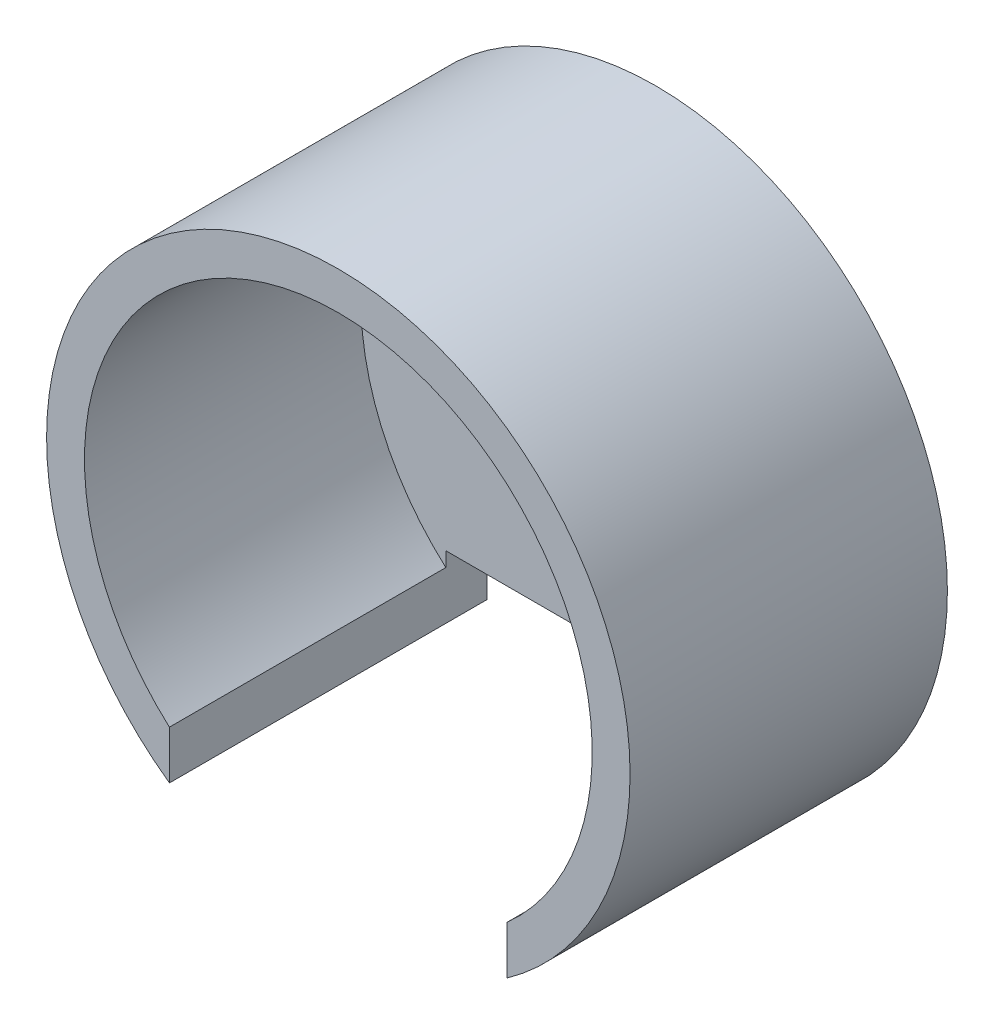
ISO-10303-21;
HEADER;
FILE_DESCRIPTION(('STEP AP214'),'2;1');
FILE_NAME('part.step','',(''),(''),'','','');
FILE_SCHEMA(('AUTOMOTIVE_DESIGN { 1 0 10303 214 1 1 1 1 }'));
ENDSEC;
DATA;
#1=APPLICATION_CONTEXT('core data for automotive mechanical design processes');
#2=APPLICATION_PROTOCOL_DEFINITION('international standard','automotive_design',2000,#1);
#3=PRODUCT_CONTEXT('',#1,'mechanical');
#4=PRODUCT('Part','Part','',(#3));
#5=PRODUCT_RELATED_PRODUCT_CATEGORY('part','',(#4));
#6=PRODUCT_DEFINITION_FORMATION('','',#4);
#7=PRODUCT_DEFINITION_CONTEXT('part definition',#1,'design');
#8=PRODUCT_DEFINITION('design','',#6,#7);
#9=PRODUCT_DEFINITION_SHAPE('','',#8);
#10=(LENGTH_UNIT() NAMED_UNIT(*) SI_UNIT(.MILLI.,.METRE.));
#11=(NAMED_UNIT(*) PLANE_ANGLE_UNIT() SI_UNIT($,.RADIAN.));
#12=(NAMED_UNIT(*) SI_UNIT($,.STERADIAN.) SOLID_ANGLE_UNIT());
#13=UNCERTAINTY_MEASURE_WITH_UNIT(LENGTH_MEASURE(1.E-05),#10,'distance_accuracy_value','');
#14=(GEOMETRIC_REPRESENTATION_CONTEXT(3) GLOBAL_UNCERTAINTY_ASSIGNED_CONTEXT((#13)) GLOBAL_UNIT_ASSIGNED_CONTEXT((#10,
#11,#12)) REPRESENTATION_CONTEXT('',''));
#15=CARTESIAN_POINT('',(0.,0.,0.));
#16=DIRECTION('',(0.,0.,1.));
#17=DIRECTION('',(1.,0.,0.));
#18=AXIS2_PLACEMENT_3D('',#15,#16,#17);
#19=CARTESIAN_POINT('',(0.,0.,13.5));
#20=DIRECTION('',(0.,0.,1.));
#21=DIRECTION('',(1.,0.,0.));
#22=AXIS2_PLACEMENT_3D('',#19,#20,#21);
#23=PLANE('',#22);
#24=DIRECTION('',(0.,1.,0.));
#25=VECTOR('',#24,1.);
#26=CARTESIAN_POINT('',(8.25,-16.2559009205842,13.5));
#27=LINE('',#26,#25);
#28=CARTESIAN_POINT('',(8.25,-11.6189500386223,13.5));
#29=VERTEX_POINT('',#28);
#30=CARTESIAN_POINT('',(8.25,-9.25729442115784,13.5));
#31=VERTEX_POINT('',#30);
#32=EDGE_CURVE('E163',#29,#31,#27,.T.);
#33=ORIENTED_EDGE('',*,*,#32,.F.);
#34=CARTESIAN_POINT('',(0.,0.,13.5));
#35=DIRECTION('',(0.,0.,1.));
#36=DIRECTION('',(1.,0.,0.));
#37=AXIS2_PLACEMENT_3D('',#34,#35,#36);
#38=CIRCLE('',#37,14.25);
#39=CARTESIAN_POINT('',(-8.25,-11.6189500386223,13.5));
#40=VERTEX_POINT('',#39);
#41=EDGE_CURVE('E102',#29,#40,#38,.T.);
#42=ORIENTED_EDGE('',*,*,#41,.T.);
#43=DIRECTION('',(0.,-1.,0.));
#44=VECTOR('',#43,1.);
#45=CARTESIAN_POINT('',(-8.25,-16.2559009205842,13.5));
#46=LINE('',#45,#44);
#47=CARTESIAN_POINT('',(-8.25,-9.25729442115784,13.5));
#48=VERTEX_POINT('',#47);
#49=EDGE_CURVE('E107',#48,#40,#46,.T.);
#50=ORIENTED_EDGE('',*,*,#49,.F.);
#51=CARTESIAN_POINT('',(0.,0.,13.5));
#52=DIRECTION('',(0.,0.,1.));
#53=DIRECTION('',(1.,0.,0.));
#54=AXIS2_PLACEMENT_3D('',#51,#52,#53);
#55=CIRCLE('',#54,12.4);
#56=EDGE_CURVE('E133',#31,#48,#55,.T.);
#57=ORIENTED_EDGE('',*,*,#56,.F.);
#58=EDGE_LOOP('',(#33,#42,#50,#57));
#59=FACE_BOUND('',#58,.T.);
#60=ADVANCED_FACE('F43',(#59),#23,.T.);
#61=CARTESIAN_POINT('',(0.,0.,13.5));
#62=DIRECTION('',(0.,0.,-1.));
#63=DIRECTION('',(-1.,0.,0.));
#64=AXIS2_PLACEMENT_3D('',#61,#62,#63);
#65=CYLINDRICAL_SURFACE('',#64,14.25);
#66=ORIENTED_EDGE('',*,*,#41,.F.);
#67=DIRECTION('',(0.,0.,-1.));
#68=VECTOR('',#67,1.);
#69=CARTESIAN_POINT('',(8.25,-11.6189500386223,13.5));
#70=LINE('',#69,#68);
#71=CARTESIAN_POINT('',(8.25,-11.6189500386223,-2.));
#72=VERTEX_POINT('',#71);
#73=EDGE_CURVE('E153',#29,#72,#70,.T.);
#74=ORIENTED_EDGE('',*,*,#73,.T.);
#75=CARTESIAN_POINT('',(0.,0.,-2.));
#76=DIRECTION('',(0.,0.,-1.));
#77=DIRECTION('',(-1.,0.,0.));
#78=AXIS2_PLACEMENT_3D('',#75,#76,#77);
#79=CIRCLE('',#78,14.25);
#80=CARTESIAN_POINT('',(-8.25,-11.6189500386223,-2.));
#81=VERTEX_POINT('',#80);
#82=EDGE_CURVE('E113',#81,#72,#79,.T.);
#83=ORIENTED_EDGE('',*,*,#82,.F.);
#84=DIRECTION('',(0.,0.,-1.));
#85=VECTOR('',#84,1.);
#86=CARTESIAN_POINT('',(-8.25,-11.6189500386223,13.5));
#87=LINE('',#86,#85);
#88=EDGE_CURVE('E142',#81,#40,#87,.F.);
#89=ORIENTED_EDGE('',*,*,#88,.T.);
#90=EDGE_LOOP('',(#66,#74,#83,#89));
#91=FACE_BOUND('',#90,.T.);
#92=ADVANCED_FACE('F45',(#91),#65,.T.);
#93=CARTESIAN_POINT('',(0.,0.,13.5));
#94=DIRECTION('',(0.,0.,-1.));
#95=DIRECTION('',(-1.,0.,0.));
#96=AXIS2_PLACEMENT_3D('',#93,#94,#95);
#97=CYLINDRICAL_SURFACE('',#96,12.4);
#98=DIRECTION('',(0.,0.,-1.));
#99=VECTOR('',#98,1.);
#100=CARTESIAN_POINT('',(8.25,-9.25729442115784,13.5));
#101=LINE('',#100,#99);
#102=CARTESIAN_POINT('',(8.25,-9.25729442115784,0.));
#103=VERTEX_POINT('',#102);
#104=EDGE_CURVE('E66',#31,#103,#101,.T.);
#105=ORIENTED_EDGE('',*,*,#104,.F.);
#106=ORIENTED_EDGE('',*,*,#56,.T.);
#107=DIRECTION('',(0.,0.,-1.));
#108=VECTOR('',#107,1.);
#109=CARTESIAN_POINT('',(-8.25,-9.25729442115784,13.5));
#110=LINE('',#109,#108);
#111=CARTESIAN_POINT('',(-8.25,-9.25729442115784,0.));
#112=VERTEX_POINT('',#111);
#113=EDGE_CURVE('E148',#112,#48,#110,.F.);
#114=ORIENTED_EDGE('',*,*,#113,.F.);
#115=CARTESIAN_POINT('',(0.,0.,0.));
#116=DIRECTION('',(0.,0.,1.));
#117=DIRECTION('',(1.,0.,0.));
#118=AXIS2_PLACEMENT_3D('',#115,#116,#117);
#119=CIRCLE('',#118,12.4);
#120=EDGE_CURVE('E130',#103,#112,#119,.T.);
#121=ORIENTED_EDGE('',*,*,#120,.F.);
#122=EDGE_LOOP('',(#105,#106,#114,#121));
#123=FACE_BOUND('',#122,.T.);
#124=ADVANCED_FACE('F159',(#123),#97,.F.);
#125=CARTESIAN_POINT('',(0.,0.,0.));
#126=DIRECTION('',(0.,0.,-1.));
#127=DIRECTION('',(-1.,0.,0.));
#128=AXIS2_PLACEMENT_3D('',#125,#126,#127);
#129=PLANE('',#128);
#130=CARTESIAN_POINT('',(0.,0.,0.));
#131=DIRECTION('',(0.,0.,-1.));
#132=DIRECTION('',(-1.,0.,0.));
#133=AXIS2_PLACEMENT_3D('',#130,#131,#132);
#134=CIRCLE('',#133,4.5);
#135=CARTESIAN_POINT('',(-4.5,0.,0.));
#136=VERTEX_POINT('',#135);
#137=EDGE_CURVE('E117',#136,#136,#134,.T.);
#138=ORIENTED_EDGE('',*,*,#137,.T.);
#139=EDGE_LOOP('',(#138));
#140=FACE_BOUND('',#139,.T.);
#141=CARTESIAN_POINT('',(10.,0.,0.));
#142=DIRECTION('',(0.,0.,-1.));
#143=DIRECTION('',(-1.,0.,0.));
#144=AXIS2_PLACEMENT_3D('',#141,#142,#143);
#145=CIRCLE('',#144,1.5);
#146=CARTESIAN_POINT('',(8.5,0.,0.));
#147=VERTEX_POINT('',#146);
#148=EDGE_CURVE('E123',#147,#147,#145,.T.);
#149=ORIENTED_EDGE('',*,*,#148,.T.);
#150=EDGE_LOOP('',(#149));
#151=FACE_BOUND('',#150,.T.);
#152=DIRECTION('',(1.,0.,0.));
#153=VECTOR('',#152,1.);
#154=CARTESIAN_POINT('',(0.,-8.54409907941579,0.));
#155=LINE('',#154,#153);
#156=CARTESIAN_POINT('',(-8.25,-8.54409907941579,0.));
#157=VERTEX_POINT('',#156);
#158=CARTESIAN_POINT('',(8.25,-8.54409907941579,0.));
#159=VERTEX_POINT('',#158);
#160=EDGE_CURVE('E146',#157,#159,#155,.T.);
#161=ORIENTED_EDGE('',*,*,#160,.T.);
#162=DIRECTION('',(0.,-1.,0.));
#163=VECTOR('',#162,1.);
#164=CARTESIAN_POINT('',(8.25,0.,0.));
#165=LINE('',#164,#163);
#166=EDGE_CURVE('E106',#159,#103,#165,.T.);
#167=ORIENTED_EDGE('',*,*,#166,.T.);
#168=ORIENTED_EDGE('',*,*,#120,.T.);
#169=DIRECTION('',(0.,1.,0.));
#170=VECTOR('',#169,1.);
#171=CARTESIAN_POINT('',(-8.25,0.,0.));
#172=LINE('',#171,#170);
#173=EDGE_CURVE('E145',#112,#157,#172,.T.);
#174=ORIENTED_EDGE('',*,*,#173,.T.);
#175=EDGE_LOOP('',(#161,#167,#168,#174));
#176=FACE_BOUND('',#175,.T.);
#177=ADVANCED_FACE('F156',(#140,#151,#176),#129,.F.);
#178=CARTESIAN_POINT('',(10.,0.,-2.));
#179=DIRECTION('',(0.,0.,1.));
#180=DIRECTION('',(1.,0.,0.));
#181=AXIS2_PLACEMENT_3D('',#178,#179,#180);
#182=CYLINDRICAL_SURFACE('',#181,1.5);
#183=CARTESIAN_POINT('',(10.,0.,-2.));
#184=DIRECTION('',(0.,0.,-1.));
#185=DIRECTION('',(-1.,0.,0.));
#186=AXIS2_PLACEMENT_3D('',#183,#184,#185);
#187=CIRCLE('',#186,1.5);
#188=CARTESIAN_POINT('',(8.5,0.,-2.));
#189=VERTEX_POINT('',#188);
#190=EDGE_CURVE('E116',#189,#189,#187,.T.);
#191=ORIENTED_EDGE('',*,*,#190,.T.);
#192=EDGE_LOOP('',(#191));
#193=FACE_BOUND('',#192,.T.);
#194=ORIENTED_EDGE('',*,*,#148,.F.);
#195=EDGE_LOOP('',(#194));
#196=FACE_BOUND('',#195,.T.);
#197=ADVANCED_FACE('F176',(#193,#196),#182,.F.);
#198=CARTESIAN_POINT('',(0.,0.,-2.));
#199=DIRECTION('',(0.,0.,1.));
#200=DIRECTION('',(1.,0.,0.));
#201=AXIS2_PLACEMENT_3D('',#198,#199,#200);
#202=CYLINDRICAL_SURFACE('',#201,4.5);
#203=CARTESIAN_POINT('',(0.,0.,-2.));
#204=DIRECTION('',(0.,0.,-1.));
#205=DIRECTION('',(-1.,0.,0.));
#206=AXIS2_PLACEMENT_3D('',#203,#204,#205);
#207=CIRCLE('',#206,4.5);
#208=CARTESIAN_POINT('',(-4.5,0.,-2.));
#209=VERTEX_POINT('',#208);
#210=EDGE_CURVE('E120',#209,#209,#207,.T.);
#211=ORIENTED_EDGE('',*,*,#210,.T.);
#212=EDGE_LOOP('',(#211));
#213=FACE_BOUND('',#212,.T.);
#214=ORIENTED_EDGE('',*,*,#137,.F.);
#215=EDGE_LOOP('',(#214));
#216=FACE_BOUND('',#215,.T.);
#217=ADVANCED_FACE('F179',(#213,#216),#202,.F.);
#218=CARTESIAN_POINT('',(0.,0.,-2.));
#219=DIRECTION('',(0.,0.,-1.));
#220=DIRECTION('',(-1.,0.,0.));
#221=AXIS2_PLACEMENT_3D('',#218,#219,#220);
#222=PLANE('',#221);
#223=DIRECTION('',(0.,-1.,0.));
#224=VECTOR('',#223,1.);
#225=CARTESIAN_POINT('',(8.25,0.,-2.));
#226=LINE('',#225,#224);
#227=CARTESIAN_POINT('',(8.25,-8.54409907941579,-2.));
#228=VERTEX_POINT('',#227);
#229=EDGE_CURVE('E11',#228,#72,#226,.T.);
#230=ORIENTED_EDGE('',*,*,#229,.F.);
#231=DIRECTION('',(1.,0.,0.));
#232=VECTOR('',#231,1.);
#233=CARTESIAN_POINT('',(0.,-8.54409907941579,-2.));
#234=LINE('',#233,#232);
#235=CARTESIAN_POINT('',(-8.25,-8.54409907941579,-2.));
#236=VERTEX_POINT('',#235);
#237=EDGE_CURVE('E94',#236,#228,#234,.T.);
#238=ORIENTED_EDGE('',*,*,#237,.F.);
#239=DIRECTION('',(0.,1.,0.));
#240=VECTOR('',#239,1.);
#241=CARTESIAN_POINT('',(-8.25,0.,-2.));
#242=LINE('',#241,#240);
#243=EDGE_CURVE('E51',#81,#236,#242,.T.);
#244=ORIENTED_EDGE('',*,*,#243,.F.);
#245=ORIENTED_EDGE('',*,*,#82,.T.);
#246=EDGE_LOOP('',(#230,#238,#244,#245));
#247=FACE_BOUND('',#246,.T.);
#248=ORIENTED_EDGE('',*,*,#190,.F.);
#249=EDGE_LOOP('',(#248));
#250=FACE_BOUND('',#249,.T.);
#251=ORIENTED_EDGE('',*,*,#210,.F.);
#252=EDGE_LOOP('',(#251));
#253=FACE_BOUND('',#252,.T.);
#254=ADVANCED_FACE('F110',(#247,#250,#253),#222,.T.);
#255=CARTESIAN_POINT('',(8.25,-16.2559009205842,-5.5));
#256=DIRECTION('',(1.,0.,0.));
#257=DIRECTION('',(0.,0.,-1.));
#258=AXIS2_PLACEMENT_3D('',#255,#256,#257);
#259=PLANE('',#258);
#260=ORIENTED_EDGE('',*,*,#104,.T.);
#261=ORIENTED_EDGE('',*,*,#166,.F.);
#262=DIRECTION('',(0.,0.,1.));
#263=VECTOR('',#262,1.);
#264=CARTESIAN_POINT('',(8.25,-8.54409907941579,-5.5));
#265=LINE('',#264,#263);
#266=EDGE_CURVE('E97',#228,#159,#265,.T.);
#267=ORIENTED_EDGE('',*,*,#266,.F.);
#268=ORIENTED_EDGE('',*,*,#229,.T.);
#269=ORIENTED_EDGE('',*,*,#73,.F.);
#270=ORIENTED_EDGE('',*,*,#32,.T.);
#271=EDGE_LOOP('',(#260,#261,#267,#268,#269,#270));
#272=FACE_BOUND('',#271,.T.);
#273=ADVANCED_FACE('F104',(#272),#259,.F.);
#274=CARTESIAN_POINT('',(-8.25,-16.2559009205842,-5.5));
#275=DIRECTION('',(-1.,0.,0.));
#276=DIRECTION('',(0.,0.,1.));
#277=AXIS2_PLACEMENT_3D('',#274,#275,#276);
#278=PLANE('',#277);
#279=ORIENTED_EDGE('',*,*,#113,.T.);
#280=ORIENTED_EDGE('',*,*,#49,.T.);
#281=ORIENTED_EDGE('',*,*,#88,.F.);
#282=ORIENTED_EDGE('',*,*,#243,.T.);
#283=DIRECTION('',(0.,0.,1.));
#284=VECTOR('',#283,1.);
#285=CARTESIAN_POINT('',(-8.25,-8.54409907941579,-5.5));
#286=LINE('',#285,#284);
#287=EDGE_CURVE('E58',#236,#157,#286,.T.);
#288=ORIENTED_EDGE('',*,*,#287,.T.);
#289=ORIENTED_EDGE('',*,*,#173,.F.);
#290=EDGE_LOOP('',(#279,#280,#281,#282,#288,#289));
#291=FACE_BOUND('',#290,.T.);
#292=ADVANCED_FACE('F140',(#291),#278,.F.);
#293=CARTESIAN_POINT('',(-8.25,-8.54409907941579,-5.5));
#294=DIRECTION('',(0.,1.,0.));
#295=DIRECTION('',(0.,0.,1.));
#296=AXIS2_PLACEMENT_3D('',#293,#294,#295);
#297=PLANE('',#296);
#298=ORIENTED_EDGE('',*,*,#287,.F.);
#299=ORIENTED_EDGE('',*,*,#237,.T.);
#300=ORIENTED_EDGE('',*,*,#266,.T.);
#301=ORIENTED_EDGE('',*,*,#160,.F.);
#302=EDGE_LOOP('',(#298,#299,#300,#301));
#303=FACE_BOUND('',#302,.T.);
#304=ADVANCED_FACE('F96',(#303),#297,.F.);
#305=CLOSED_SHELL('',(#60,#92,#124,#177,#197,#217,#254,#273,#292,#304));
#306=MANIFOLD_SOLID_BREP('B2',#305);
#307=ADVANCED_BREP_SHAPE_REPRESENTATION('',(#18,#306),#14);
#308=SHAPE_DEFINITION_REPRESENTATION(#9,#307);
ENDSEC;
END-ISO-10303-21;
